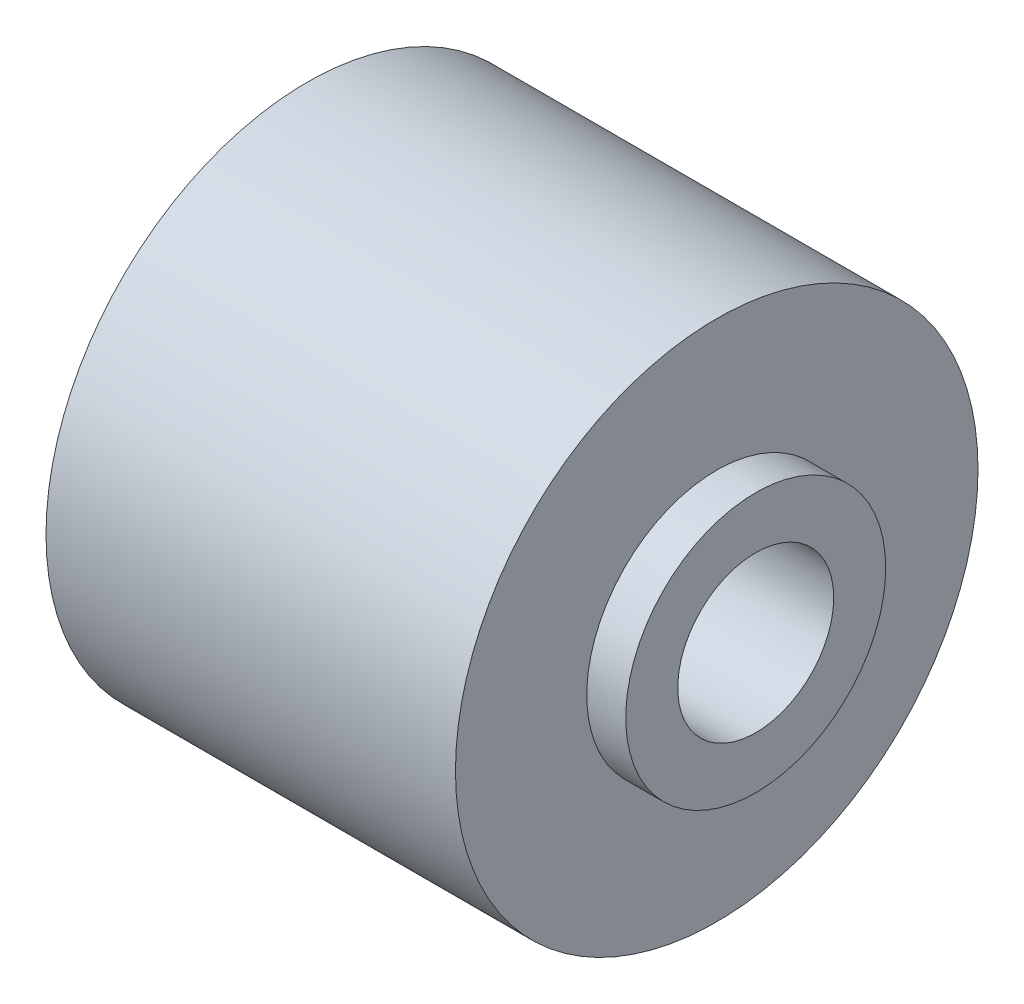
ISO-10303-21;
HEADER;
FILE_DESCRIPTION(('STEP AP214'),'2;1');
FILE_NAME('part.step','',(''),(''),'','','');
FILE_SCHEMA(('AUTOMOTIVE_DESIGN { 1 0 10303 214 1 1 1 1 }'));
ENDSEC;
DATA;
#1=APPLICATION_CONTEXT('core data for automotive mechanical design processes');
#2=APPLICATION_PROTOCOL_DEFINITION('international standard','automotive_design',2000,#1);
#3=PRODUCT_CONTEXT('',#1,'mechanical');
#4=PRODUCT('Part','Part','',(#3));
#5=PRODUCT_RELATED_PRODUCT_CATEGORY('part','',(#4));
#6=PRODUCT_DEFINITION_FORMATION('','',#4);
#7=PRODUCT_DEFINITION_CONTEXT('part definition',#1,'design');
#8=PRODUCT_DEFINITION('design','',#6,#7);
#9=PRODUCT_DEFINITION_SHAPE('','',#8);
#10=(LENGTH_UNIT() NAMED_UNIT(*) SI_UNIT(.MILLI.,.METRE.));
#11=(NAMED_UNIT(*) PLANE_ANGLE_UNIT() SI_UNIT($,.RADIAN.));
#12=(NAMED_UNIT(*) SI_UNIT($,.STERADIAN.) SOLID_ANGLE_UNIT());
#13=UNCERTAINTY_MEASURE_WITH_UNIT(LENGTH_MEASURE(1.E-05),#10,'distance_accuracy_value','');
#14=(GEOMETRIC_REPRESENTATION_CONTEXT(3) GLOBAL_UNCERTAINTY_ASSIGNED_CONTEXT((#13)) GLOBAL_UNIT_ASSIGNED_CONTEXT((#10,
#11,#12)) REPRESENTATION_CONTEXT('',''));
#15=CARTESIAN_POINT('',(0.,0.,0.));
#16=DIRECTION('',(0.,0.,1.));
#17=DIRECTION('',(1.,0.,0.));
#18=AXIS2_PLACEMENT_3D('',#15,#16,#17);
#19=CARTESIAN_POINT('',(0.,0.,0.));
#20=DIRECTION('',(1.,0.,0.));
#21=DIRECTION('',(0.,0.,-1.));
#22=AXIS2_PLACEMENT_3D('',#19,#20,#21);
#23=CYLINDRICAL_SURFACE('',#22,6.);
#24=CARTESIAN_POINT('',(18.75,0.,0.));
#25=DIRECTION('',(1.,0.,0.));
#26=DIRECTION('',(0.,0.,-1.));
#27=AXIS2_PLACEMENT_3D('',#24,#25,#26);
#28=CIRCLE('',#27,6.);
#29=CARTESIAN_POINT('',(18.75,0.,-6.));
#30=VERTEX_POINT('',#29);
#31=EDGE_CURVE('E10',#30,#30,#28,.T.);
#32=ORIENTED_EDGE('',*,*,#31,.T.);
#33=EDGE_LOOP('',(#32));
#34=FACE_BOUND('',#33,.T.);
#35=CARTESIAN_POINT('',(-18.75,0.,0.));
#36=DIRECTION('',(1.,0.,0.));
#37=DIRECTION('',(0.,0.,-1.));
#38=AXIS2_PLACEMENT_3D('',#35,#36,#37);
#39=CIRCLE('',#38,6.);
#40=CARTESIAN_POINT('',(-18.75,0.,-6.));
#41=VERTEX_POINT('',#40);
#42=EDGE_CURVE('E62',#41,#41,#39,.T.);
#43=ORIENTED_EDGE('',*,*,#42,.F.);
#44=EDGE_LOOP('',(#43));
#45=FACE_BOUND('',#44,.T.);
#46=ADVANCED_FACE('F34',(#34,#45),#23,.F.);
#47=CARTESIAN_POINT('',(18.75,0.,0.));
#48=DIRECTION('',(1.,0.,0.));
#49=DIRECTION('',(0.,0.,-1.));
#50=AXIS2_PLACEMENT_3D('',#47,#48,#49);
#51=PLANE('',#50);
#52=CARTESIAN_POINT('',(18.75,0.,0.));
#53=DIRECTION('',(1.,0.,0.));
#54=DIRECTION('',(0.,0.,-1.));
#55=AXIS2_PLACEMENT_3D('',#52,#53,#54);
#56=CIRCLE('',#55,10.);
#57=CARTESIAN_POINT('',(18.75,0.,-10.));
#58=VERTEX_POINT('',#57);
#59=EDGE_CURVE('E40',#58,#58,#56,.T.);
#60=ORIENTED_EDGE('',*,*,#59,.T.);
#61=EDGE_LOOP('',(#60));
#62=FACE_BOUND('',#61,.T.);
#63=ORIENTED_EDGE('',*,*,#31,.F.);
#64=EDGE_LOOP('',(#63));
#65=FACE_BOUND('',#64,.T.);
#66=ADVANCED_FACE('F69',(#62,#65),#51,.T.);
#67=CARTESIAN_POINT('',(0.,0.,0.));
#68=DIRECTION('',(1.,0.,0.));
#69=DIRECTION('',(0.,0.,-1.));
#70=AXIS2_PLACEMENT_3D('',#67,#68,#69);
#71=CYLINDRICAL_SURFACE('',#70,10.);
#72=ORIENTED_EDGE('',*,*,#59,.F.);
#73=EDGE_LOOP('',(#72));
#74=FACE_BOUND('',#73,.T.);
#75=CARTESIAN_POINT('',(15.75,0.,0.));
#76=DIRECTION('',(1.,0.,0.));
#77=DIRECTION('',(0.,0.,-1.));
#78=AXIS2_PLACEMENT_3D('',#75,#76,#77);
#79=CIRCLE('',#78,10.);
#80=CARTESIAN_POINT('',(15.75,0.,-10.));
#81=VERTEX_POINT('',#80);
#82=EDGE_CURVE('E44',#81,#81,#79,.T.);
#83=ORIENTED_EDGE('',*,*,#82,.T.);
#84=EDGE_LOOP('',(#83));
#85=FACE_BOUND('',#84,.T.);
#86=ADVANCED_FACE('F73',(#74,#85),#71,.T.);
#87=CARTESIAN_POINT('',(15.75,0.,0.));
#88=DIRECTION('',(1.,0.,0.));
#89=DIRECTION('',(0.,0.,-1.));
#90=AXIS2_PLACEMENT_3D('',#87,#88,#89);
#91=PLANE('',#90);
#92=CARTESIAN_POINT('',(15.75,0.,0.));
#93=DIRECTION('',(1.,0.,0.));
#94=DIRECTION('',(0.,0.,-1.));
#95=AXIS2_PLACEMENT_3D('',#92,#93,#94);
#96=CIRCLE('',#95,20.1);
#97=CARTESIAN_POINT('',(15.75,0.,-20.1));
#98=VERTEX_POINT('',#97);
#99=EDGE_CURVE('E48',#98,#98,#96,.T.);
#100=ORIENTED_EDGE('',*,*,#99,.T.);
#101=EDGE_LOOP('',(#100));
#102=FACE_BOUND('',#101,.T.);
#103=ORIENTED_EDGE('',*,*,#82,.F.);
#104=EDGE_LOOP('',(#103));
#105=FACE_BOUND('',#104,.T.);
#106=ADVANCED_FACE('F77',(#102,#105),#91,.T.);
#107=CARTESIAN_POINT('',(0.,0.,0.));
#108=DIRECTION('',(1.,0.,0.));
#109=DIRECTION('',(0.,0.,-1.));
#110=AXIS2_PLACEMENT_3D('',#107,#108,#109);
#111=CYLINDRICAL_SURFACE('',#110,20.1);
#112=ORIENTED_EDGE('',*,*,#99,.F.);
#113=EDGE_LOOP('',(#112));
#114=FACE_BOUND('',#113,.T.);
#115=CARTESIAN_POINT('',(-15.75,0.,0.));
#116=DIRECTION('',(1.,0.,0.));
#117=DIRECTION('',(0.,0.,-1.));
#118=AXIS2_PLACEMENT_3D('',#115,#116,#117);
#119=CIRCLE('',#118,20.1);
#120=CARTESIAN_POINT('',(-15.75,0.,-20.1));
#121=VERTEX_POINT('',#120);
#122=EDGE_CURVE('E53',#121,#121,#119,.T.);
#123=ORIENTED_EDGE('',*,*,#122,.T.);
#124=EDGE_LOOP('',(#123));
#125=FACE_BOUND('',#124,.T.);
#126=ADVANCED_FACE('F84',(#114,#125),#111,.T.);
#127=CARTESIAN_POINT('',(-15.75,0.,0.));
#128=DIRECTION('',(1.,0.,0.));
#129=DIRECTION('',(0.,0.,-1.));
#130=AXIS2_PLACEMENT_3D('',#127,#128,#129);
#131=PLANE('',#130);
#132=ORIENTED_EDGE('',*,*,#122,.F.);
#133=EDGE_LOOP('',(#132));
#134=FACE_BOUND('',#133,.T.);
#135=CARTESIAN_POINT('',(-15.75,0.,0.));
#136=DIRECTION('',(1.,0.,0.));
#137=DIRECTION('',(0.,0.,-1.));
#138=AXIS2_PLACEMENT_3D('',#135,#136,#137);
#139=CIRCLE('',#138,10.);
#140=CARTESIAN_POINT('',(-15.75,0.,-10.));
#141=VERTEX_POINT('',#140);
#142=EDGE_CURVE('E56',#141,#141,#139,.T.);
#143=ORIENTED_EDGE('',*,*,#142,.T.);
#144=EDGE_LOOP('',(#143));
#145=FACE_BOUND('',#144,.T.);
#146=ADVANCED_FACE('F88',(#134,#145),#131,.F.);
#147=CARTESIAN_POINT('',(0.,0.,0.));
#148=DIRECTION('',(1.,0.,0.));
#149=DIRECTION('',(0.,0.,-1.));
#150=AXIS2_PLACEMENT_3D('',#147,#148,#149);
#151=CYLINDRICAL_SURFACE('',#150,10.);
#152=CARTESIAN_POINT('',(-18.75,0.,0.));
#153=DIRECTION('',(1.,0.,0.));
#154=DIRECTION('',(0.,0.,-1.));
#155=AXIS2_PLACEMENT_3D('',#152,#153,#154);
#156=CIRCLE('',#155,10.);
#157=CARTESIAN_POINT('',(-18.75,0.,-10.));
#158=VERTEX_POINT('',#157);
#159=EDGE_CURVE('E59',#158,#158,#156,.T.);
#160=ORIENTED_EDGE('',*,*,#159,.T.);
#161=EDGE_LOOP('',(#160));
#162=FACE_BOUND('',#161,.T.);
#163=ORIENTED_EDGE('',*,*,#142,.F.);
#164=EDGE_LOOP('',(#163));
#165=FACE_BOUND('',#164,.T.);
#166=ADVANCED_FACE('F92',(#162,#165),#151,.T.);
#167=CARTESIAN_POINT('',(-18.75,0.,0.));
#168=DIRECTION('',(1.,0.,0.));
#169=DIRECTION('',(0.,0.,-1.));
#170=AXIS2_PLACEMENT_3D('',#167,#168,#169);
#171=PLANE('',#170);
#172=ORIENTED_EDGE('',*,*,#159,.F.);
#173=EDGE_LOOP('',(#172));
#174=FACE_BOUND('',#173,.T.);
#175=ORIENTED_EDGE('',*,*,#42,.T.);
#176=EDGE_LOOP('',(#175));
#177=FACE_BOUND('',#176,.T.);
#178=ADVANCED_FACE('F66',(#174,#177),#171,.F.);
#179=CLOSED_SHELL('',(#46,#66,#86,#106,#126,#146,#166,#178));
#180=MANIFOLD_SOLID_BREP('B2',#179);
#181=ADVANCED_BREP_SHAPE_REPRESENTATION('',(#18,#180),#14);
#182=SHAPE_DEFINITION_REPRESENTATION(#9,#181);
ENDSEC;
END-ISO-10303-21;
